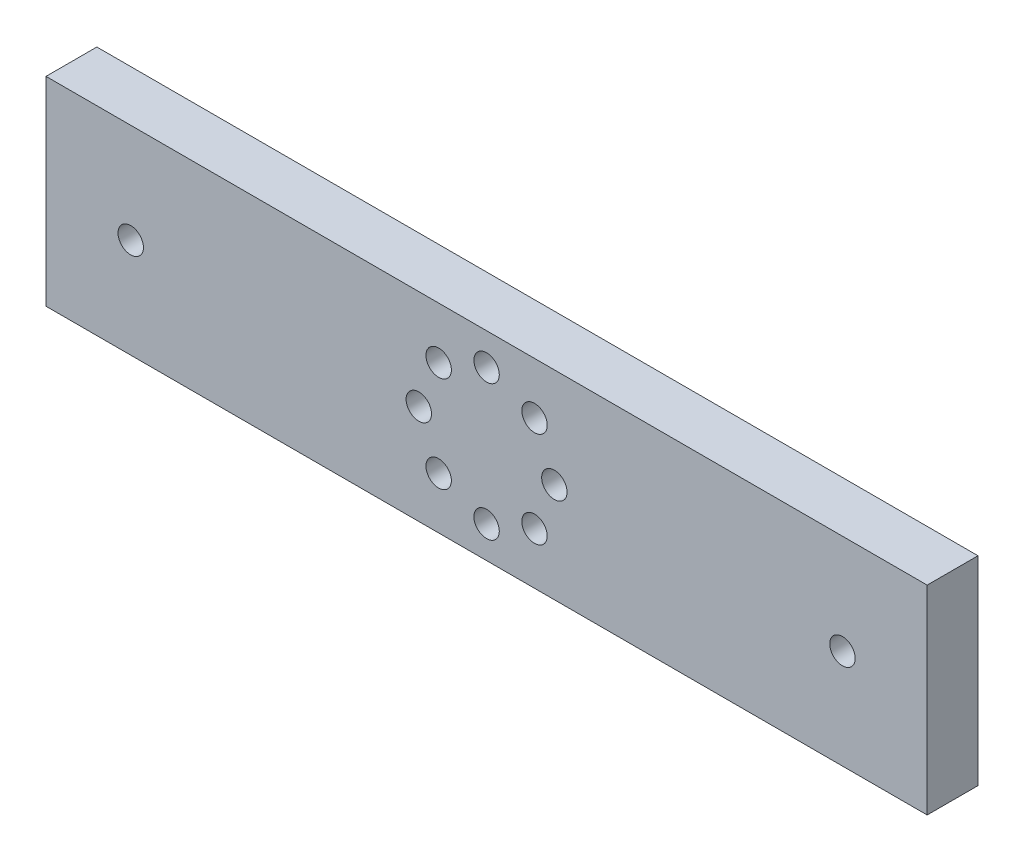
ISO-10303-21;
HEADER;
FILE_DESCRIPTION(('STEP AP214'),'2;1');
FILE_NAME('part.step','',(''),(''),'','','');
FILE_SCHEMA(('AUTOMOTIVE_DESIGN { 1 0 10303 214 1 1 1 1 }'));
ENDSEC;
DATA;
#1=APPLICATION_CONTEXT('core data for automotive mechanical design processes');
#2=APPLICATION_PROTOCOL_DEFINITION('international standard','automotive_design',2000,#1);
#3=PRODUCT_CONTEXT('',#1,'mechanical');
#4=PRODUCT('Part','Part','',(#3));
#5=PRODUCT_RELATED_PRODUCT_CATEGORY('part','',(#4));
#6=PRODUCT_DEFINITION_FORMATION('','',#4);
#7=PRODUCT_DEFINITION_CONTEXT('part definition',#1,'design');
#8=PRODUCT_DEFINITION('design','',#6,#7);
#9=PRODUCT_DEFINITION_SHAPE('','',#8);
#10=(LENGTH_UNIT() NAMED_UNIT(*) SI_UNIT(.MILLI.,.METRE.));
#11=(NAMED_UNIT(*) PLANE_ANGLE_UNIT() SI_UNIT($,.RADIAN.));
#12=(NAMED_UNIT(*) SI_UNIT($,.STERADIAN.) SOLID_ANGLE_UNIT());
#13=UNCERTAINTY_MEASURE_WITH_UNIT(LENGTH_MEASURE(1.E-05),#10,'distance_accuracy_value','');
#14=(GEOMETRIC_REPRESENTATION_CONTEXT(3) GLOBAL_UNCERTAINTY_ASSIGNED_CONTEXT((#13)) GLOBAL_UNIT_ASSIGNED_CONTEXT((#10,
#11,#12)) REPRESENTATION_CONTEXT('',''));
#15=CARTESIAN_POINT('',(0.,0.,0.));
#16=DIRECTION('',(0.,0.,1.));
#17=DIRECTION('',(1.,0.,0.));
#18=AXIS2_PLACEMENT_3D('',#15,#16,#17);
#19=CARTESIAN_POINT('',(0.,0.,12.));
#20=DIRECTION('',(0.,0.,1.));
#21=DIRECTION('',(1.,0.,0.));
#22=AXIS2_PLACEMENT_3D('',#19,#20,#21);
#23=PLANE('',#22);
#24=CARTESIAN_POINT('',(11.3137084989849,11.3137084989846,12.));
#25=DIRECTION('',(0.,0.,1.));
#26=DIRECTION('',(1.,0.,0.));
#27=AXIS2_PLACEMENT_3D('',#24,#25,#26);
#28=CIRCLE('',#27,3.);
#29=CARTESIAN_POINT('',(14.3137084989849,11.3137084989846,12.));
#30=VERTEX_POINT('',#29);
#31=EDGE_CURVE('E157',#30,#30,#28,.T.);
#32=ORIENTED_EDGE('',*,*,#31,.F.);
#33=EDGE_LOOP('',(#32));
#34=FACE_BOUND('',#33,.T.);
#35=CARTESIAN_POINT('',(-11.3137084989847,11.3137084989849,12.));
#36=DIRECTION('',(0.,0.,1.));
#37=DIRECTION('',(1.,0.,0.));
#38=AXIS2_PLACEMENT_3D('',#35,#36,#37);
#39=CIRCLE('',#38,3.);
#40=CARTESIAN_POINT('',(-8.31370849898466,11.3137084989849,12.));
#41=VERTEX_POINT('',#40);
#42=EDGE_CURVE('E145',#41,#41,#39,.T.);
#43=ORIENTED_EDGE('',*,*,#42,.F.);
#44=EDGE_LOOP('',(#43));
#45=FACE_BOUND('',#44,.T.);
#46=CARTESIAN_POINT('',(-11.3137084989848,-11.3137084989847,12.));
#47=DIRECTION('',(0.,0.,1.));
#48=DIRECTION('',(1.,0.,0.));
#49=AXIS2_PLACEMENT_3D('',#46,#47,#48);
#50=CIRCLE('',#49,3.);
#51=CARTESIAN_POINT('',(-8.31370849898482,-11.3137084989847,12.));
#52=VERTEX_POINT('',#51);
#53=EDGE_CURVE('E133',#52,#52,#50,.T.);
#54=ORIENTED_EDGE('',*,*,#53,.F.);
#55=EDGE_LOOP('',(#54));
#56=FACE_BOUND('',#55,.T.);
#57=CARTESIAN_POINT('',(11.3137084989847,-11.3137084989848,12.));
#58=DIRECTION('',(0.,0.,1.));
#59=DIRECTION('',(1.,0.,0.));
#60=AXIS2_PLACEMENT_3D('',#57,#58,#59);
#61=CIRCLE('',#60,3.);
#62=CARTESIAN_POINT('',(14.3137084989847,-11.3137084989848,12.));
#63=VERTEX_POINT('',#62);
#64=EDGE_CURVE('E121',#63,#63,#61,.T.);
#65=ORIENTED_EDGE('',*,*,#64,.F.);
#66=EDGE_LOOP('',(#65));
#67=FACE_BOUND('',#66,.T.);
#68=CARTESIAN_POINT('',(16.,0.,12.));
#69=DIRECTION('',(0.,0.,1.));
#70=DIRECTION('',(1.,0.,0.));
#71=AXIS2_PLACEMENT_3D('',#68,#69,#70);
#72=CIRCLE('',#71,3.);
#73=CARTESIAN_POINT('',(19.,0.,12.));
#74=VERTEX_POINT('',#73);
#75=EDGE_CURVE('E100',#74,#74,#72,.T.);
#76=ORIENTED_EDGE('',*,*,#75,.F.);
#77=EDGE_LOOP('',(#76));
#78=FACE_BOUND('',#77,.T.);
#79=DIRECTION('',(0.,-1.,0.));
#80=VECTOR('',#79,1.);
#81=CARTESIAN_POINT('',(-104.,-23.5,12.));
#82=LINE('',#81,#80);
#83=CARTESIAN_POINT('',(-104.,23.5,12.));
#84=VERTEX_POINT('',#83);
#85=CARTESIAN_POINT('',(-104.,-23.5,12.));
#86=VERTEX_POINT('',#85);
#87=EDGE_CURVE('E85',#84,#86,#82,.T.);
#88=ORIENTED_EDGE('',*,*,#87,.T.);
#89=DIRECTION('',(1.,0.,0.));
#90=VECTOR('',#89,1.);
#91=CARTESIAN_POINT('',(104.,-23.5,12.));
#92=LINE('',#91,#90);
#93=CARTESIAN_POINT('',(104.,-23.5,12.));
#94=VERTEX_POINT('',#93);
#95=EDGE_CURVE('E80',#86,#94,#92,.T.);
#96=ORIENTED_EDGE('',*,*,#95,.T.);
#97=DIRECTION('',(0.,1.,0.));
#98=VECTOR('',#97,1.);
#99=CARTESIAN_POINT('',(104.,-23.5,12.));
#100=LINE('',#99,#98);
#101=CARTESIAN_POINT('',(104.,23.5,12.));
#102=VERTEX_POINT('',#101);
#103=EDGE_CURVE('E83',#94,#102,#100,.T.);
#104=ORIENTED_EDGE('',*,*,#103,.T.);
#105=DIRECTION('',(-1.,0.,0.));
#106=VECTOR('',#105,1.);
#107=CARTESIAN_POINT('',(104.,23.5,12.));
#108=LINE('',#107,#106);
#109=EDGE_CURVE('E50',#102,#84,#108,.T.);
#110=ORIENTED_EDGE('',*,*,#109,.T.);
#111=EDGE_LOOP('',(#88,#96,#104,#110));
#112=FACE_BOUND('',#111,.T.);
#113=CARTESIAN_POINT('',(-84.,1.1172740284298E-13,12.));
#114=DIRECTION('',(0.,0.,1.));
#115=DIRECTION('',(1.,0.,0.));
#116=AXIS2_PLACEMENT_3D('',#113,#114,#115);
#117=CIRCLE('',#116,3.00000000000001);
#118=CARTESIAN_POINT('',(-81.,1.1172740284298E-13,12.));
#119=VERTEX_POINT('',#118);
#120=EDGE_CURVE('E115',#119,#119,#117,.T.);
#121=ORIENTED_EDGE('',*,*,#120,.F.);
#122=EDGE_LOOP('',(#121));
#123=FACE_BOUND('',#122,.T.);
#124=CARTESIAN_POINT('',(0.,-16.,12.));
#125=DIRECTION('',(0.,0.,1.));
#126=DIRECTION('',(1.,0.,0.));
#127=AXIS2_PLACEMENT_3D('',#124,#125,#126);
#128=CIRCLE('',#127,3.);
#129=CARTESIAN_POINT('',(2.99999999999995,-16.,12.));
#130=VERTEX_POINT('',#129);
#131=EDGE_CURVE('E127',#130,#130,#128,.T.);
#132=ORIENTED_EDGE('',*,*,#131,.F.);
#133=EDGE_LOOP('',(#132));
#134=FACE_BOUND('',#133,.T.);
#135=CARTESIAN_POINT('',(-16.,1.1172740284298E-13,12.));
#136=DIRECTION('',(0.,0.,1.));
#137=DIRECTION('',(1.,0.,0.));
#138=AXIS2_PLACEMENT_3D('',#135,#136,#137);
#139=CIRCLE('',#138,3.);
#140=CARTESIAN_POINT('',(-13.,1.1172740284298E-13,12.));
#141=VERTEX_POINT('',#140);
#142=EDGE_CURVE('E139',#141,#141,#139,.T.);
#143=ORIENTED_EDGE('',*,*,#142,.F.);
#144=EDGE_LOOP('',(#143));
#145=FACE_BOUND('',#144,.T.);
#146=CARTESIAN_POINT('',(1.6759110426447E-13,16.,12.));
#147=DIRECTION('',(0.,0.,1.));
#148=DIRECTION('',(1.,0.,0.));
#149=AXIS2_PLACEMENT_3D('',#146,#147,#148);
#150=CIRCLE('',#149,3.);
#151=CARTESIAN_POINT('',(3.00000000000017,16.,12.));
#152=VERTEX_POINT('',#151);
#153=EDGE_CURVE('E151',#152,#152,#150,.T.);
#154=ORIENTED_EDGE('',*,*,#153,.F.);
#155=EDGE_LOOP('',(#154));
#156=FACE_BOUND('',#155,.T.);
#157=CARTESIAN_POINT('',(84.,0.,12.));
#158=DIRECTION('',(0.,0.,1.));
#159=DIRECTION('',(1.,0.,0.));
#160=AXIS2_PLACEMENT_3D('',#157,#158,#159);
#161=CIRCLE('',#160,3.00000000000001);
#162=CARTESIAN_POINT('',(87.,0.,12.));
#163=VERTEX_POINT('',#162);
#164=EDGE_CURVE('E163',#163,#163,#161,.T.);
#165=ORIENTED_EDGE('',*,*,#164,.F.);
#166=EDGE_LOOP('',(#165));
#167=FACE_BOUND('',#166,.T.);
#168=ADVANCED_FACE('F33',(#34,#45,#56,#67,#78,#112,#123,#134,#145,#156,#167),#23,.T.);
#169=CARTESIAN_POINT('',(0.,0.,0.));
#170=DIRECTION('',(0.,0.,1.));
#171=DIRECTION('',(1.,0.,0.));
#172=AXIS2_PLACEMENT_3D('',#169,#170,#171);
#173=PLANE('',#172);
#174=DIRECTION('',(0.,-1.,0.));
#175=VECTOR('',#174,1.);
#176=CARTESIAN_POINT('',(-104.,-23.5,0.));
#177=LINE('',#176,#175);
#178=CARTESIAN_POINT('',(-104.,23.5,0.));
#179=VERTEX_POINT('',#178);
#180=CARTESIAN_POINT('',(-104.,-23.5,0.));
#181=VERTEX_POINT('',#180);
#182=EDGE_CURVE('E97',#179,#181,#177,.T.);
#183=ORIENTED_EDGE('',*,*,#182,.F.);
#184=DIRECTION('',(-1.,0.,0.));
#185=VECTOR('',#184,1.);
#186=CARTESIAN_POINT('',(104.,23.5,0.));
#187=LINE('',#186,#185);
#188=CARTESIAN_POINT('',(104.,23.5,0.));
#189=VERTEX_POINT('',#188);
#190=EDGE_CURVE('E73',#189,#179,#187,.T.);
#191=ORIENTED_EDGE('',*,*,#190,.F.);
#192=DIRECTION('',(0.,1.,0.));
#193=VECTOR('',#192,1.);
#194=CARTESIAN_POINT('',(104.,-23.5,0.));
#195=LINE('',#194,#193);
#196=CARTESIAN_POINT('',(104.,-23.5,0.));
#197=VERTEX_POINT('',#196);
#198=EDGE_CURVE('E67',#197,#189,#195,.T.);
#199=ORIENTED_EDGE('',*,*,#198,.F.);
#200=DIRECTION('',(1.,0.,0.));
#201=VECTOR('',#200,1.);
#202=CARTESIAN_POINT('',(104.,-23.5,0.));
#203=LINE('',#202,#201);
#204=EDGE_CURVE('E89',#181,#197,#203,.T.);
#205=ORIENTED_EDGE('',*,*,#204,.F.);
#206=EDGE_LOOP('',(#183,#191,#199,#205));
#207=FACE_BOUND('',#206,.T.);
#208=CARTESIAN_POINT('',(16.,0.,0.));
#209=DIRECTION('',(0.,0.,1.));
#210=DIRECTION('',(1.,0.,0.));
#211=AXIS2_PLACEMENT_3D('',#208,#209,#210);
#212=CIRCLE('',#211,3.);
#213=CARTESIAN_POINT('',(19.,0.,0.));
#214=VERTEX_POINT('',#213);
#215=EDGE_CURVE('E112',#214,#214,#212,.T.);
#216=ORIENTED_EDGE('',*,*,#215,.T.);
#217=EDGE_LOOP('',(#216));
#218=FACE_BOUND('',#217,.T.);
#219=CARTESIAN_POINT('',(-84.,1.1172740284298E-13,0.));
#220=DIRECTION('',(0.,0.,1.));
#221=DIRECTION('',(1.,0.,0.));
#222=AXIS2_PLACEMENT_3D('',#219,#220,#221);
#223=CIRCLE('',#222,3.00000000000001);
#224=CARTESIAN_POINT('',(-81.,1.1172740284298E-13,0.));
#225=VERTEX_POINT('',#224);
#226=EDGE_CURVE('E118',#225,#225,#223,.T.);
#227=ORIENTED_EDGE('',*,*,#226,.T.);
#228=EDGE_LOOP('',(#227));
#229=FACE_BOUND('',#228,.T.);
#230=CARTESIAN_POINT('',(11.3137084989847,-11.3137084989848,0.));
#231=DIRECTION('',(0.,0.,1.));
#232=DIRECTION('',(1.,0.,0.));
#233=AXIS2_PLACEMENT_3D('',#230,#231,#232);
#234=CIRCLE('',#233,3.);
#235=CARTESIAN_POINT('',(14.3137084989847,-11.3137084989848,0.));
#236=VERTEX_POINT('',#235);
#237=EDGE_CURVE('E124',#236,#236,#234,.T.);
#238=ORIENTED_EDGE('',*,*,#237,.T.);
#239=EDGE_LOOP('',(#238));
#240=FACE_BOUND('',#239,.T.);
#241=CARTESIAN_POINT('',(0.,-16.,0.));
#242=DIRECTION('',(0.,0.,1.));
#243=DIRECTION('',(1.,0.,0.));
#244=AXIS2_PLACEMENT_3D('',#241,#242,#243);
#245=CIRCLE('',#244,3.);
#246=CARTESIAN_POINT('',(2.99999999999995,-16.,0.));
#247=VERTEX_POINT('',#246);
#248=EDGE_CURVE('E130',#247,#247,#245,.T.);
#249=ORIENTED_EDGE('',*,*,#248,.T.);
#250=EDGE_LOOP('',(#249));
#251=FACE_BOUND('',#250,.T.);
#252=CARTESIAN_POINT('',(-11.3137084989848,-11.3137084989847,0.));
#253=DIRECTION('',(0.,0.,1.));
#254=DIRECTION('',(1.,0.,0.));
#255=AXIS2_PLACEMENT_3D('',#252,#253,#254);
#256=CIRCLE('',#255,3.);
#257=CARTESIAN_POINT('',(-8.31370849898482,-11.3137084989847,0.));
#258=VERTEX_POINT('',#257);
#259=EDGE_CURVE('E136',#258,#258,#256,.T.);
#260=ORIENTED_EDGE('',*,*,#259,.T.);
#261=EDGE_LOOP('',(#260));
#262=FACE_BOUND('',#261,.T.);
#263=CARTESIAN_POINT('',(-16.,1.1172740284298E-13,0.));
#264=DIRECTION('',(0.,0.,1.));
#265=DIRECTION('',(1.,0.,0.));
#266=AXIS2_PLACEMENT_3D('',#263,#264,#265);
#267=CIRCLE('',#266,3.);
#268=CARTESIAN_POINT('',(-13.,1.1172740284298E-13,0.));
#269=VERTEX_POINT('',#268);
#270=EDGE_CURVE('E142',#269,#269,#267,.T.);
#271=ORIENTED_EDGE('',*,*,#270,.T.);
#272=EDGE_LOOP('',(#271));
#273=FACE_BOUND('',#272,.T.);
#274=CARTESIAN_POINT('',(-11.3137084989847,11.3137084989849,0.));
#275=DIRECTION('',(0.,0.,1.));
#276=DIRECTION('',(1.,0.,0.));
#277=AXIS2_PLACEMENT_3D('',#274,#275,#276);
#278=CIRCLE('',#277,3.);
#279=CARTESIAN_POINT('',(-8.31370849898466,11.3137084989849,0.));
#280=VERTEX_POINT('',#279);
#281=EDGE_CURVE('E148',#280,#280,#278,.T.);
#282=ORIENTED_EDGE('',*,*,#281,.T.);
#283=EDGE_LOOP('',(#282));
#284=FACE_BOUND('',#283,.T.);
#285=CARTESIAN_POINT('',(1.6759110426447E-13,16.,0.));
#286=DIRECTION('',(0.,0.,1.));
#287=DIRECTION('',(1.,0.,0.));
#288=AXIS2_PLACEMENT_3D('',#285,#286,#287);
#289=CIRCLE('',#288,3.);
#290=CARTESIAN_POINT('',(3.00000000000017,16.,0.));
#291=VERTEX_POINT('',#290);
#292=EDGE_CURVE('E154',#291,#291,#289,.T.);
#293=ORIENTED_EDGE('',*,*,#292,.T.);
#294=EDGE_LOOP('',(#293));
#295=FACE_BOUND('',#294,.T.);
#296=CARTESIAN_POINT('',(11.3137084989849,11.3137084989846,0.));
#297=DIRECTION('',(0.,0.,1.));
#298=DIRECTION('',(1.,0.,0.));
#299=AXIS2_PLACEMENT_3D('',#296,#297,#298);
#300=CIRCLE('',#299,3.);
#301=CARTESIAN_POINT('',(14.3137084989849,11.3137084989846,0.));
#302=VERTEX_POINT('',#301);
#303=EDGE_CURVE('E160',#302,#302,#300,.T.);
#304=ORIENTED_EDGE('',*,*,#303,.T.);
#305=EDGE_LOOP('',(#304));
#306=FACE_BOUND('',#305,.T.);
#307=CARTESIAN_POINT('',(84.,0.,0.));
#308=DIRECTION('',(0.,0.,1.));
#309=DIRECTION('',(1.,0.,0.));
#310=AXIS2_PLACEMENT_3D('',#307,#308,#309);
#311=CIRCLE('',#310,3.00000000000001);
#312=CARTESIAN_POINT('',(87.,0.,0.));
#313=VERTEX_POINT('',#312);
#314=EDGE_CURVE('E166',#313,#313,#311,.T.);
#315=ORIENTED_EDGE('',*,*,#314,.T.);
#316=EDGE_LOOP('',(#315));
#317=FACE_BOUND('',#316,.T.);
#318=ADVANCED_FACE('F108',(#207,#218,#229,#240,#251,#262,#273,#284,#295,#306,#317),#173,.F.);
#319=CARTESIAN_POINT('',(-104.,-23.5,12.));
#320=DIRECTION('',(1.,0.,0.));
#321=DIRECTION('',(0.,0.,-1.));
#322=AXIS2_PLACEMENT_3D('',#319,#320,#321);
#323=PLANE('',#322);
#324=ORIENTED_EDGE('',*,*,#182,.T.);
#325=DIRECTION('',(0.,0.,-1.));
#326=VECTOR('',#325,1.);
#327=CARTESIAN_POINT('',(-104.,-23.5,12.));
#328=LINE('',#327,#326);
#329=EDGE_CURVE('E11',#86,#181,#328,.T.);
#330=ORIENTED_EDGE('',*,*,#329,.F.);
#331=ORIENTED_EDGE('',*,*,#87,.F.);
#332=DIRECTION('',(0.,0.,-1.));
#333=VECTOR('',#332,1.);
#334=CARTESIAN_POINT('',(-104.,23.5,12.));
#335=LINE('',#334,#333);
#336=EDGE_CURVE('E93',#84,#179,#335,.T.);
#337=ORIENTED_EDGE('',*,*,#336,.T.);
#338=EDGE_LOOP('',(#324,#330,#331,#337));
#339=FACE_BOUND('',#338,.T.);
#340=ADVANCED_FACE('F35',(#339),#323,.F.);
#341=CARTESIAN_POINT('',(104.,-23.5,12.));
#342=DIRECTION('',(0.,1.,0.));
#343=DIRECTION('',(-1.,0.,0.));
#344=AXIS2_PLACEMENT_3D('',#341,#342,#343);
#345=PLANE('',#344);
#346=ORIENTED_EDGE('',*,*,#204,.T.);
#347=DIRECTION('',(0.,0.,-1.));
#348=VECTOR('',#347,1.);
#349=CARTESIAN_POINT('',(104.,-23.5,12.));
#350=LINE('',#349,#348);
#351=EDGE_CURVE('E42',#94,#197,#350,.T.);
#352=ORIENTED_EDGE('',*,*,#351,.F.);
#353=ORIENTED_EDGE('',*,*,#95,.F.);
#354=ORIENTED_EDGE('',*,*,#329,.T.);
#355=EDGE_LOOP('',(#346,#352,#353,#354));
#356=FACE_BOUND('',#355,.T.);
#357=ADVANCED_FACE('F88',(#356),#345,.F.);
#358=CARTESIAN_POINT('',(104.,-23.5,12.));
#359=DIRECTION('',(-1.,0.,0.));
#360=DIRECTION('',(0.,0.,1.));
#361=AXIS2_PLACEMENT_3D('',#358,#359,#360);
#362=PLANE('',#361);
#363=ORIENTED_EDGE('',*,*,#198,.T.);
#364=DIRECTION('',(0.,0.,-1.));
#365=VECTOR('',#364,1.);
#366=CARTESIAN_POINT('',(104.,23.5,12.));
#367=LINE('',#366,#365);
#368=EDGE_CURVE('E90',#102,#189,#367,.T.);
#369=ORIENTED_EDGE('',*,*,#368,.F.);
#370=ORIENTED_EDGE('',*,*,#103,.F.);
#371=ORIENTED_EDGE('',*,*,#351,.T.);
#372=EDGE_LOOP('',(#363,#369,#370,#371));
#373=FACE_BOUND('',#372,.T.);
#374=ADVANCED_FACE('F91',(#373),#362,.F.);
#375=CARTESIAN_POINT('',(104.,23.5,12.));
#376=DIRECTION('',(0.,-1.,0.));
#377=DIRECTION('',(1.,0.,0.));
#378=AXIS2_PLACEMENT_3D('',#375,#376,#377);
#379=PLANE('',#378);
#380=ORIENTED_EDGE('',*,*,#190,.T.);
#381=ORIENTED_EDGE('',*,*,#336,.F.);
#382=ORIENTED_EDGE('',*,*,#109,.F.);
#383=ORIENTED_EDGE('',*,*,#368,.T.);
#384=EDGE_LOOP('',(#380,#381,#382,#383));
#385=FACE_BOUND('',#384,.T.);
#386=ADVANCED_FACE('F105',(#385),#379,.F.);
#387=CARTESIAN_POINT('',(16.,0.,12.));
#388=DIRECTION('',(0.,0.,-1.));
#389=DIRECTION('',(-1.,0.,0.));
#390=AXIS2_PLACEMENT_3D('',#387,#388,#389);
#391=CYLINDRICAL_SURFACE('',#390,3.);
#392=ORIENTED_EDGE('',*,*,#75,.T.);
#393=EDGE_LOOP('',(#392));
#394=FACE_BOUND('',#393,.T.);
#395=ORIENTED_EDGE('',*,*,#215,.F.);
#396=EDGE_LOOP('',(#395));
#397=FACE_BOUND('',#396,.T.);
#398=ADVANCED_FACE('F185',(#394,#397),#391,.F.);
#399=CARTESIAN_POINT('',(-84.,1.1172740284298E-13,12.));
#400=DIRECTION('',(0.,0.,-1.));
#401=DIRECTION('',(-1.,0.,0.));
#402=AXIS2_PLACEMENT_3D('',#399,#400,#401);
#403=CYLINDRICAL_SURFACE('',#402,3.00000000000001);
#404=ORIENTED_EDGE('',*,*,#120,.T.);
#405=EDGE_LOOP('',(#404));
#406=FACE_BOUND('',#405,.T.);
#407=ORIENTED_EDGE('',*,*,#226,.F.);
#408=EDGE_LOOP('',(#407));
#409=FACE_BOUND('',#408,.T.);
#410=ADVANCED_FACE('F231',(#406,#409),#403,.F.);
#411=CARTESIAN_POINT('',(11.3137084989847,-11.3137084989848,12.));
#412=DIRECTION('',(0.,0.,-1.));
#413=DIRECTION('',(-1.,0.,0.));
#414=AXIS2_PLACEMENT_3D('',#411,#412,#413);
#415=CYLINDRICAL_SURFACE('',#414,3.);
#416=ORIENTED_EDGE('',*,*,#64,.T.);
#417=EDGE_LOOP('',(#416));
#418=FACE_BOUND('',#417,.T.);
#419=ORIENTED_EDGE('',*,*,#237,.F.);
#420=EDGE_LOOP('',(#419));
#421=FACE_BOUND('',#420,.T.);
#422=ADVANCED_FACE('F239',(#418,#421),#415,.F.);
#423=CARTESIAN_POINT('',(0.,-16.,12.));
#424=DIRECTION('',(0.,0.,-1.));
#425=DIRECTION('',(-1.,0.,0.));
#426=AXIS2_PLACEMENT_3D('',#423,#424,#425);
#427=CYLINDRICAL_SURFACE('',#426,3.);
#428=ORIENTED_EDGE('',*,*,#131,.T.);
#429=EDGE_LOOP('',(#428));
#430=FACE_BOUND('',#429,.T.);
#431=ORIENTED_EDGE('',*,*,#248,.F.);
#432=EDGE_LOOP('',(#431));
#433=FACE_BOUND('',#432,.T.);
#434=ADVANCED_FACE('F247',(#430,#433),#427,.F.);
#435=CARTESIAN_POINT('',(-11.3137084989848,-11.3137084989847,12.));
#436=DIRECTION('',(0.,0.,-1.));
#437=DIRECTION('',(-1.,0.,0.));
#438=AXIS2_PLACEMENT_3D('',#435,#436,#437);
#439=CYLINDRICAL_SURFACE('',#438,3.);
#440=ORIENTED_EDGE('',*,*,#53,.T.);
#441=EDGE_LOOP('',(#440));
#442=FACE_BOUND('',#441,.T.);
#443=ORIENTED_EDGE('',*,*,#259,.F.);
#444=EDGE_LOOP('',(#443));
#445=FACE_BOUND('',#444,.T.);
#446=ADVANCED_FACE('F256',(#442,#445),#439,.F.);
#447=CARTESIAN_POINT('',(-16.,1.1172740284298E-13,12.));
#448=DIRECTION('',(0.,0.,-1.));
#449=DIRECTION('',(-1.,0.,0.));
#450=AXIS2_PLACEMENT_3D('',#447,#448,#449);
#451=CYLINDRICAL_SURFACE('',#450,3.);
#452=ORIENTED_EDGE('',*,*,#142,.T.);
#453=EDGE_LOOP('',(#452));
#454=FACE_BOUND('',#453,.T.);
#455=ORIENTED_EDGE('',*,*,#270,.F.);
#456=EDGE_LOOP('',(#455));
#457=FACE_BOUND('',#456,.T.);
#458=ADVANCED_FACE('F265',(#454,#457),#451,.F.);
#459=CARTESIAN_POINT('',(-11.3137084989847,11.3137084989849,12.));
#460=DIRECTION('',(0.,0.,-1.));
#461=DIRECTION('',(-1.,0.,0.));
#462=AXIS2_PLACEMENT_3D('',#459,#460,#461);
#463=CYLINDRICAL_SURFACE('',#462,3.);
#464=ORIENTED_EDGE('',*,*,#42,.T.);
#465=EDGE_LOOP('',(#464));
#466=FACE_BOUND('',#465,.T.);
#467=ORIENTED_EDGE('',*,*,#281,.F.);
#468=EDGE_LOOP('',(#467));
#469=FACE_BOUND('',#468,.T.);
#470=ADVANCED_FACE('F274',(#466,#469),#463,.F.);
#471=CARTESIAN_POINT('',(1.6759110426447E-13,16.,12.));
#472=DIRECTION('',(0.,0.,-1.));
#473=DIRECTION('',(-1.,0.,0.));
#474=AXIS2_PLACEMENT_3D('',#471,#472,#473);
#475=CYLINDRICAL_SURFACE('',#474,3.);
#476=ORIENTED_EDGE('',*,*,#153,.T.);
#477=EDGE_LOOP('',(#476));
#478=FACE_BOUND('',#477,.T.);
#479=ORIENTED_EDGE('',*,*,#292,.F.);
#480=EDGE_LOOP('',(#479));
#481=FACE_BOUND('',#480,.T.);
#482=ADVANCED_FACE('F283',(#478,#481),#475,.F.);
#483=CARTESIAN_POINT('',(11.3137084989849,11.3137084989846,12.));
#484=DIRECTION('',(0.,0.,-1.));
#485=DIRECTION('',(-1.,0.,0.));
#486=AXIS2_PLACEMENT_3D('',#483,#484,#485);
#487=CYLINDRICAL_SURFACE('',#486,3.);
#488=ORIENTED_EDGE('',*,*,#31,.T.);
#489=EDGE_LOOP('',(#488));
#490=FACE_BOUND('',#489,.T.);
#491=ORIENTED_EDGE('',*,*,#303,.F.);
#492=EDGE_LOOP('',(#491));
#493=FACE_BOUND('',#492,.T.);
#494=ADVANCED_FACE('F292',(#490,#493),#487,.F.);
#495=CARTESIAN_POINT('',(84.,0.,12.));
#496=DIRECTION('',(0.,0.,-1.));
#497=DIRECTION('',(-1.,0.,0.));
#498=AXIS2_PLACEMENT_3D('',#495,#496,#497);
#499=CYLINDRICAL_SURFACE('',#498,3.00000000000001);
#500=ORIENTED_EDGE('',*,*,#164,.T.);
#501=EDGE_LOOP('',(#500));
#502=FACE_BOUND('',#501,.T.);
#503=ORIENTED_EDGE('',*,*,#314,.F.);
#504=EDGE_LOOP('',(#503));
#505=FACE_BOUND('',#504,.T.);
#506=ADVANCED_FACE('F172',(#502,#505),#499,.F.);
#507=CLOSED_SHELL('',(#168,#318,#340,#357,#374,#386,#398,#410,#422,#434,#446,#458,#470,#482,
#494,#506));
#508=MANIFOLD_SOLID_BREP('B2',#507);
#509=ADVANCED_BREP_SHAPE_REPRESENTATION('',(#18,#508),#14);
#510=SHAPE_DEFINITION_REPRESENTATION(#9,#509);
ENDSEC;
END-ISO-10303-21;
